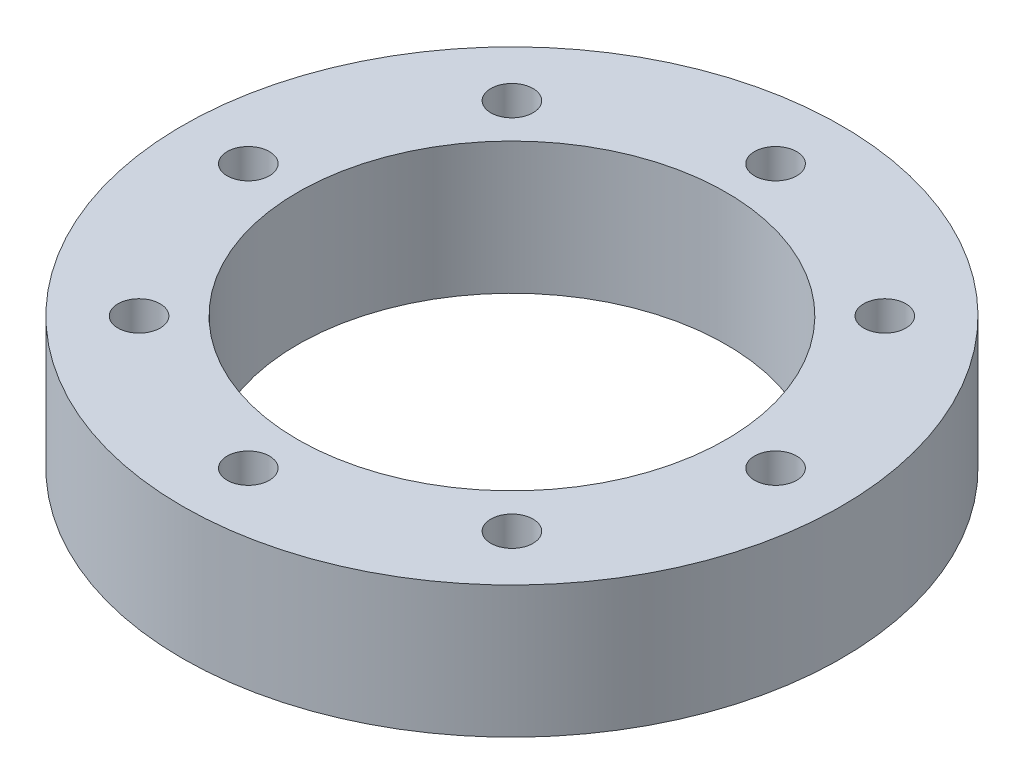
ISO-10303-21;
HEADER;
FILE_DESCRIPTION(('STEP AP214'),'2;1');
FILE_NAME('part.step','',(''),(''),'','','');
FILE_SCHEMA(('AUTOMOTIVE_DESIGN { 1 0 10303 214 1 1 1 1 }'));
ENDSEC;
DATA;
#1=APPLICATION_CONTEXT('core data for automotive mechanical design processes');
#2=APPLICATION_PROTOCOL_DEFINITION('international standard','automotive_design',2000,#1);
#3=PRODUCT_CONTEXT('',#1,'mechanical');
#4=PRODUCT('Part','Part','',(#3));
#5=PRODUCT_RELATED_PRODUCT_CATEGORY('part','',(#4));
#6=PRODUCT_DEFINITION_FORMATION('','',#4);
#7=PRODUCT_DEFINITION_CONTEXT('part definition',#1,'design');
#8=PRODUCT_DEFINITION('design','',#6,#7);
#9=PRODUCT_DEFINITION_SHAPE('','',#8);
#10=(LENGTH_UNIT() NAMED_UNIT(*) SI_UNIT(.MILLI.,.METRE.));
#11=(NAMED_UNIT(*) PLANE_ANGLE_UNIT() SI_UNIT($,.RADIAN.));
#12=(NAMED_UNIT(*) SI_UNIT($,.STERADIAN.) SOLID_ANGLE_UNIT());
#13=UNCERTAINTY_MEASURE_WITH_UNIT(LENGTH_MEASURE(1.E-05),#10,'distance_accuracy_value','');
#14=(GEOMETRIC_REPRESENTATION_CONTEXT(3) GLOBAL_UNCERTAINTY_ASSIGNED_CONTEXT((#13)) GLOBAL_UNIT_ASSIGNED_CONTEXT((#10,
#11,#12)) REPRESENTATION_CONTEXT('',''));
#15=CARTESIAN_POINT('',(0.,0.,0.));
#16=DIRECTION('',(0.,0.,1.));
#17=DIRECTION('',(1.,0.,0.));
#18=AXIS2_PLACEMENT_3D('',#15,#16,#17);
#19=CARTESIAN_POINT('',(0.,20.,0.));
#20=DIRECTION('',(0.,1.,0.));
#21=DIRECTION('',(0.,0.,1.));
#22=AXIS2_PLACEMENT_3D('',#19,#20,#21);
#23=PLANE('',#22);
#24=CARTESIAN_POINT('',(0.,20.,-40.));
#25=DIRECTION('',(0.,1.,0.));
#26=DIRECTION('',(0.,0.,1.));
#27=AXIS2_PLACEMENT_3D('',#24,#25,#26);
#28=CIRCLE('',#27,3.2);
#29=CARTESIAN_POINT('',(0.,20.,-36.8));
#30=VERTEX_POINT('',#29);
#31=EDGE_CURVE('E106',#30,#30,#28,.T.);
#32=ORIENTED_EDGE('',*,*,#31,.F.);
#33=EDGE_LOOP('',(#32));
#34=FACE_BOUND('',#33,.T.);
#35=CARTESIAN_POINT('',(28.2842712474619,20.,-28.2842712474619));
#36=DIRECTION('',(0.,1.,0.));
#37=DIRECTION('',(0.,0.,1.));
#38=AXIS2_PLACEMENT_3D('',#35,#36,#37);
#39=CIRCLE('',#38,3.2);
#40=CARTESIAN_POINT('',(28.2842712474619,20.,-25.0842712474619));
#41=VERTEX_POINT('',#40);
#42=EDGE_CURVE('E100',#41,#41,#39,.T.);
#43=ORIENTED_EDGE('',*,*,#42,.F.);
#44=EDGE_LOOP('',(#43));
#45=FACE_BOUND('',#44,.T.);
#46=CARTESIAN_POINT('',(40.,20.,0.));
#47=DIRECTION('',(0.,1.,0.));
#48=DIRECTION('',(0.,0.,1.));
#49=AXIS2_PLACEMENT_3D('',#46,#47,#48);
#50=CIRCLE('',#49,3.2);
#51=CARTESIAN_POINT('',(40.,20.,3.2));
#52=VERTEX_POINT('',#51);
#53=EDGE_CURVE('E94',#52,#52,#50,.T.);
#54=ORIENTED_EDGE('',*,*,#53,.F.);
#55=EDGE_LOOP('',(#54));
#56=FACE_BOUND('',#55,.T.);
#57=CARTESIAN_POINT('',(28.2842712474619,20.,28.2842712474619));
#58=DIRECTION('',(0.,1.,0.));
#59=DIRECTION('',(0.,0.,1.));
#60=AXIS2_PLACEMENT_3D('',#57,#58,#59);
#61=CIRCLE('',#60,3.2);
#62=CARTESIAN_POINT('',(28.2842712474619,20.,31.4842712474619));
#63=VERTEX_POINT('',#62);
#64=EDGE_CURVE('E88',#63,#63,#61,.T.);
#65=ORIENTED_EDGE('',*,*,#64,.F.);
#66=EDGE_LOOP('',(#65));
#67=FACE_BOUND('',#66,.T.);
#68=CARTESIAN_POINT('',(0.,20.,40.));
#69=DIRECTION('',(0.,1.,0.));
#70=DIRECTION('',(0.,0.,1.));
#71=AXIS2_PLACEMENT_3D('',#68,#69,#70);
#72=CIRCLE('',#71,3.2);
#73=CARTESIAN_POINT('',(0.,20.,43.2));
#74=VERTEX_POINT('',#73);
#75=EDGE_CURVE('E82',#74,#74,#72,.T.);
#76=ORIENTED_EDGE('',*,*,#75,.F.);
#77=EDGE_LOOP('',(#76));
#78=FACE_BOUND('',#77,.T.);
#79=CARTESIAN_POINT('',(-28.2842712474619,20.,28.2842712474619));
#80=DIRECTION('',(0.,1.,0.));
#81=DIRECTION('',(0.,0.,1.));
#82=AXIS2_PLACEMENT_3D('',#79,#80,#81);
#83=CIRCLE('',#82,3.2);
#84=CARTESIAN_POINT('',(-28.2842712474619,20.,31.4842712474619));
#85=VERTEX_POINT('',#84);
#86=EDGE_CURVE('E76',#85,#85,#83,.T.);
#87=ORIENTED_EDGE('',*,*,#86,.F.);
#88=EDGE_LOOP('',(#87));
#89=FACE_BOUND('',#88,.T.);
#90=CARTESIAN_POINT('',(-40.,20.,0.));
#91=DIRECTION('',(0.,1.,0.));
#92=DIRECTION('',(0.,0.,1.));
#93=AXIS2_PLACEMENT_3D('',#90,#91,#92);
#94=CIRCLE('',#93,3.2);
#95=CARTESIAN_POINT('',(-40.,20.,3.20000000000001));
#96=VERTEX_POINT('',#95);
#97=EDGE_CURVE('E70',#96,#96,#94,.T.);
#98=ORIENTED_EDGE('',*,*,#97,.F.);
#99=EDGE_LOOP('',(#98));
#100=FACE_BOUND('',#99,.T.);
#101=CARTESIAN_POINT('',(-28.2842712474619,20.,-28.2842712474619));
#102=DIRECTION('',(0.,1.,0.));
#103=DIRECTION('',(0.,0.,1.));
#104=AXIS2_PLACEMENT_3D('',#101,#102,#103);
#105=CIRCLE('',#104,3.2);
#106=CARTESIAN_POINT('',(-28.2842712474619,20.,-25.0842712474619));
#107=VERTEX_POINT('',#106);
#108=EDGE_CURVE('E64',#107,#107,#105,.T.);
#109=ORIENTED_EDGE('',*,*,#108,.F.);
#110=EDGE_LOOP('',(#109));
#111=FACE_BOUND('',#110,.T.);
#112=CARTESIAN_POINT('',(0.,20.,0.));
#113=DIRECTION('',(0.,1.,0.));
#114=DIRECTION('',(0.,0.,1.));
#115=AXIS2_PLACEMENT_3D('',#112,#113,#114);
#116=CIRCLE('',#115,50.);
#117=CARTESIAN_POINT('',(0.,20.,50.));
#118=VERTEX_POINT('',#117);
#119=EDGE_CURVE('E10',#118,#118,#116,.T.);
#120=ORIENTED_EDGE('',*,*,#119,.T.);
#121=EDGE_LOOP('',(#120));
#122=FACE_BOUND('',#121,.T.);
#123=CARTESIAN_POINT('',(0.,20.,0.));
#124=DIRECTION('',(0.,1.,0.));
#125=DIRECTION('',(0.,0.,1.));
#126=AXIS2_PLACEMENT_3D('',#123,#124,#125);
#127=CIRCLE('',#126,32.5);
#128=CARTESIAN_POINT('',(0.,20.,32.5));
#129=VERTEX_POINT('',#128);
#130=EDGE_CURVE('E56',#129,#129,#127,.T.);
#131=ORIENTED_EDGE('',*,*,#130,.F.);
#132=EDGE_LOOP('',(#131));
#133=FACE_BOUND('',#132,.T.);
#134=ADVANCED_FACE('F45',(#34,#45,#56,#67,#78,#89,#100,#111,#122,#133),#23,.T.);
#135=CARTESIAN_POINT('',(0.,0.,0.));
#136=DIRECTION('',(0.,1.,0.));
#137=DIRECTION('',(0.,0.,1.));
#138=AXIS2_PLACEMENT_3D('',#135,#136,#137);
#139=PLANE('',#138);
#140=CARTESIAN_POINT('',(0.,0.,-40.));
#141=DIRECTION('',(0.,1.,0.));
#142=DIRECTION('',(0.,0.,1.));
#143=AXIS2_PLACEMENT_3D('',#140,#141,#142);
#144=CIRCLE('',#143,3.2);
#145=CARTESIAN_POINT('',(0.,0.,-36.8));
#146=VERTEX_POINT('',#145);
#147=EDGE_CURVE('E61',#146,#146,#144,.T.);
#148=ORIENTED_EDGE('',*,*,#147,.T.);
#149=EDGE_LOOP('',(#148));
#150=FACE_BOUND('',#149,.T.);
#151=CARTESIAN_POINT('',(28.2842712474619,0.,-28.2842712474619));
#152=DIRECTION('',(0.,1.,0.));
#153=DIRECTION('',(0.,0.,1.));
#154=AXIS2_PLACEMENT_3D('',#151,#152,#153);
#155=CIRCLE('',#154,3.2);
#156=CARTESIAN_POINT('',(28.2842712474619,0.,-25.0842712474619));
#157=VERTEX_POINT('',#156);
#158=EDGE_CURVE('E103',#157,#157,#155,.T.);
#159=ORIENTED_EDGE('',*,*,#158,.T.);
#160=EDGE_LOOP('',(#159));
#161=FACE_BOUND('',#160,.T.);
#162=CARTESIAN_POINT('',(40.,0.,0.));
#163=DIRECTION('',(0.,1.,0.));
#164=DIRECTION('',(0.,0.,1.));
#165=AXIS2_PLACEMENT_3D('',#162,#163,#164);
#166=CIRCLE('',#165,3.2);
#167=CARTESIAN_POINT('',(40.,0.,3.2));
#168=VERTEX_POINT('',#167);
#169=EDGE_CURVE('E97',#168,#168,#166,.T.);
#170=ORIENTED_EDGE('',*,*,#169,.T.);
#171=EDGE_LOOP('',(#170));
#172=FACE_BOUND('',#171,.T.);
#173=CARTESIAN_POINT('',(28.2842712474619,0.,28.2842712474619));
#174=DIRECTION('',(0.,1.,0.));
#175=DIRECTION('',(0.,0.,1.));
#176=AXIS2_PLACEMENT_3D('',#173,#174,#175);
#177=CIRCLE('',#176,3.2);
#178=CARTESIAN_POINT('',(28.2842712474619,0.,31.4842712474619));
#179=VERTEX_POINT('',#178);
#180=EDGE_CURVE('E91',#179,#179,#177,.T.);
#181=ORIENTED_EDGE('',*,*,#180,.T.);
#182=EDGE_LOOP('',(#181));
#183=FACE_BOUND('',#182,.T.);
#184=CARTESIAN_POINT('',(0.,0.,40.));
#185=DIRECTION('',(0.,1.,0.));
#186=DIRECTION('',(0.,0.,1.));
#187=AXIS2_PLACEMENT_3D('',#184,#185,#186);
#188=CIRCLE('',#187,3.2);
#189=CARTESIAN_POINT('',(0.,0.,43.2));
#190=VERTEX_POINT('',#189);
#191=EDGE_CURVE('E85',#190,#190,#188,.T.);
#192=ORIENTED_EDGE('',*,*,#191,.T.);
#193=EDGE_LOOP('',(#192));
#194=FACE_BOUND('',#193,.T.);
#195=CARTESIAN_POINT('',(-28.2842712474619,0.,28.2842712474619));
#196=DIRECTION('',(0.,1.,0.));
#197=DIRECTION('',(0.,0.,1.));
#198=AXIS2_PLACEMENT_3D('',#195,#196,#197);
#199=CIRCLE('',#198,3.2);
#200=CARTESIAN_POINT('',(-28.2842712474619,0.,31.4842712474619));
#201=VERTEX_POINT('',#200);
#202=EDGE_CURVE('E79',#201,#201,#199,.T.);
#203=ORIENTED_EDGE('',*,*,#202,.T.);
#204=EDGE_LOOP('',(#203));
#205=FACE_BOUND('',#204,.T.);
#206=CARTESIAN_POINT('',(-40.,0.,0.));
#207=DIRECTION('',(0.,1.,0.));
#208=DIRECTION('',(0.,0.,1.));
#209=AXIS2_PLACEMENT_3D('',#206,#207,#208);
#210=CIRCLE('',#209,3.2);
#211=CARTESIAN_POINT('',(-40.,0.,3.20000000000001));
#212=VERTEX_POINT('',#211);
#213=EDGE_CURVE('E73',#212,#212,#210,.T.);
#214=ORIENTED_EDGE('',*,*,#213,.T.);
#215=EDGE_LOOP('',(#214));
#216=FACE_BOUND('',#215,.T.);
#217=CARTESIAN_POINT('',(-28.2842712474619,0.,-28.2842712474619));
#218=DIRECTION('',(0.,1.,0.));
#219=DIRECTION('',(0.,0.,1.));
#220=AXIS2_PLACEMENT_3D('',#217,#218,#219);
#221=CIRCLE('',#220,3.2);
#222=CARTESIAN_POINT('',(-28.2842712474619,0.,-25.0842712474619));
#223=VERTEX_POINT('',#222);
#224=EDGE_CURVE('E67',#223,#223,#221,.T.);
#225=ORIENTED_EDGE('',*,*,#224,.T.);
#226=EDGE_LOOP('',(#225));
#227=FACE_BOUND('',#226,.T.);
#228=CARTESIAN_POINT('',(0.,0.,0.));
#229=DIRECTION('',(0.,1.,0.));
#230=DIRECTION('',(0.,0.,1.));
#231=AXIS2_PLACEMENT_3D('',#228,#229,#230);
#232=CIRCLE('',#231,50.);
#233=CARTESIAN_POINT('',(0.,0.,50.));
#234=VERTEX_POINT('',#233);
#235=EDGE_CURVE('E49',#234,#234,#232,.T.);
#236=ORIENTED_EDGE('',*,*,#235,.F.);
#237=EDGE_LOOP('',(#236));
#238=FACE_BOUND('',#237,.T.);
#239=CARTESIAN_POINT('',(0.,0.,0.));
#240=DIRECTION('',(0.,1.,0.));
#241=DIRECTION('',(0.,0.,1.));
#242=AXIS2_PLACEMENT_3D('',#239,#240,#241);
#243=CIRCLE('',#242,32.5);
#244=CARTESIAN_POINT('',(0.,0.,32.5));
#245=VERTEX_POINT('',#244);
#246=EDGE_CURVE('E58',#245,#245,#243,.T.);
#247=ORIENTED_EDGE('',*,*,#246,.T.);
#248=EDGE_LOOP('',(#247));
#249=FACE_BOUND('',#248,.T.);
#250=ADVANCED_FACE('F112',(#150,#161,#172,#183,#194,#205,#216,#227,#238,#249),#139,.F.);
#251=CARTESIAN_POINT('',(0.,20.,0.));
#252=DIRECTION('',(0.,-1.,0.));
#253=DIRECTION('',(0.,0.,-1.));
#254=AXIS2_PLACEMENT_3D('',#251,#252,#253);
#255=CYLINDRICAL_SURFACE('',#254,50.);
#256=ORIENTED_EDGE('',*,*,#119,.F.);
#257=EDGE_LOOP('',(#256));
#258=FACE_BOUND('',#257,.T.);
#259=ORIENTED_EDGE('',*,*,#235,.T.);
#260=EDGE_LOOP('',(#259));
#261=FACE_BOUND('',#260,.T.);
#262=ADVANCED_FACE('F47',(#258,#261),#255,.T.);
#263=CARTESIAN_POINT('',(0.,20.,0.));
#264=DIRECTION('',(0.,-1.,0.));
#265=DIRECTION('',(0.,0.,-1.));
#266=AXIS2_PLACEMENT_3D('',#263,#264,#265);
#267=CYLINDRICAL_SURFACE('',#266,32.5);
#268=ORIENTED_EDGE('',*,*,#130,.T.);
#269=EDGE_LOOP('',(#268));
#270=FACE_BOUND('',#269,.T.);
#271=ORIENTED_EDGE('',*,*,#246,.F.);
#272=EDGE_LOOP('',(#271));
#273=FACE_BOUND('',#272,.T.);
#274=ADVANCED_FACE('F141',(#270,#273),#267,.F.);
#275=CARTESIAN_POINT('',(-28.2842712474619,0.,-28.2842712474619));
#276=DIRECTION('',(0.,1.,0.));
#277=DIRECTION('',(0.,0.,1.));
#278=AXIS2_PLACEMENT_3D('',#275,#276,#277);
#279=CYLINDRICAL_SURFACE('',#278,3.2);
#280=ORIENTED_EDGE('',*,*,#224,.F.);
#281=EDGE_LOOP('',(#280));
#282=FACE_BOUND('',#281,.T.);
#283=ORIENTED_EDGE('',*,*,#108,.T.);
#284=EDGE_LOOP('',(#283));
#285=FACE_BOUND('',#284,.T.);
#286=ADVANCED_FACE('F144',(#282,#285),#279,.F.);
#287=CARTESIAN_POINT('',(-40.,0.,0.));
#288=DIRECTION('',(0.,1.,0.));
#289=DIRECTION('',(0.,0.,1.));
#290=AXIS2_PLACEMENT_3D('',#287,#288,#289);
#291=CYLINDRICAL_SURFACE('',#290,3.2);
#292=ORIENTED_EDGE('',*,*,#213,.F.);
#293=EDGE_LOOP('',(#292));
#294=FACE_BOUND('',#293,.T.);
#295=ORIENTED_EDGE('',*,*,#97,.T.);
#296=EDGE_LOOP('',(#295));
#297=FACE_BOUND('',#296,.T.);
#298=ADVANCED_FACE('F157',(#294,#297),#291,.F.);
#299=CARTESIAN_POINT('',(-28.2842712474619,0.,28.2842712474619));
#300=DIRECTION('',(0.,1.,0.));
#301=DIRECTION('',(0.,0.,1.));
#302=AXIS2_PLACEMENT_3D('',#299,#300,#301);
#303=CYLINDRICAL_SURFACE('',#302,3.2);
#304=ORIENTED_EDGE('',*,*,#202,.F.);
#305=EDGE_LOOP('',(#304));
#306=FACE_BOUND('',#305,.T.);
#307=ORIENTED_EDGE('',*,*,#86,.T.);
#308=EDGE_LOOP('',(#307));
#309=FACE_BOUND('',#308,.T.);
#310=ADVANCED_FACE('F161',(#306,#309),#303,.F.);
#311=CARTESIAN_POINT('',(0.,0.,40.));
#312=DIRECTION('',(0.,1.,0.));
#313=DIRECTION('',(0.,0.,1.));
#314=AXIS2_PLACEMENT_3D('',#311,#312,#313);
#315=CYLINDRICAL_SURFACE('',#314,3.2);
#316=ORIENTED_EDGE('',*,*,#191,.F.);
#317=EDGE_LOOP('',(#316));
#318=FACE_BOUND('',#317,.T.);
#319=ORIENTED_EDGE('',*,*,#75,.T.);
#320=EDGE_LOOP('',(#319));
#321=FACE_BOUND('',#320,.T.);
#322=ADVANCED_FACE('F165',(#318,#321),#315,.F.);
#323=CARTESIAN_POINT('',(28.2842712474619,0.,28.2842712474619));
#324=DIRECTION('',(0.,1.,0.));
#325=DIRECTION('',(0.,0.,1.));
#326=AXIS2_PLACEMENT_3D('',#323,#324,#325);
#327=CYLINDRICAL_SURFACE('',#326,3.2);
#328=ORIENTED_EDGE('',*,*,#180,.F.);
#329=EDGE_LOOP('',(#328));
#330=FACE_BOUND('',#329,.T.);
#331=ORIENTED_EDGE('',*,*,#64,.T.);
#332=EDGE_LOOP('',(#331));
#333=FACE_BOUND('',#332,.T.);
#334=ADVANCED_FACE('F169',(#330,#333),#327,.F.);
#335=CARTESIAN_POINT('',(40.,0.,0.));
#336=DIRECTION('',(0.,1.,0.));
#337=DIRECTION('',(0.,0.,1.));
#338=AXIS2_PLACEMENT_3D('',#335,#336,#337);
#339=CYLINDRICAL_SURFACE('',#338,3.2);
#340=ORIENTED_EDGE('',*,*,#169,.F.);
#341=EDGE_LOOP('',(#340));
#342=FACE_BOUND('',#341,.T.);
#343=ORIENTED_EDGE('',*,*,#53,.T.);
#344=EDGE_LOOP('',(#343));
#345=FACE_BOUND('',#344,.T.);
#346=ADVANCED_FACE('F173',(#342,#345),#339,.F.);
#347=CARTESIAN_POINT('',(28.2842712474619,0.,-28.2842712474619));
#348=DIRECTION('',(0.,1.,0.));
#349=DIRECTION('',(0.,0.,1.));
#350=AXIS2_PLACEMENT_3D('',#347,#348,#349);
#351=CYLINDRICAL_SURFACE('',#350,3.2);
#352=ORIENTED_EDGE('',*,*,#158,.F.);
#353=EDGE_LOOP('',(#352));
#354=FACE_BOUND('',#353,.T.);
#355=ORIENTED_EDGE('',*,*,#42,.T.);
#356=EDGE_LOOP('',(#355));
#357=FACE_BOUND('',#356,.T.);
#358=ADVANCED_FACE('F118',(#354,#357),#351,.F.);
#359=CARTESIAN_POINT('',(0.,0.,-40.));
#360=DIRECTION('',(0.,1.,0.));
#361=DIRECTION('',(0.,0.,1.));
#362=AXIS2_PLACEMENT_3D('',#359,#360,#361);
#363=CYLINDRICAL_SURFACE('',#362,3.2);
#364=ORIENTED_EDGE('',*,*,#147,.F.);
#365=EDGE_LOOP('',(#364));
#366=FACE_BOUND('',#365,.T.);
#367=ORIENTED_EDGE('',*,*,#31,.T.);
#368=EDGE_LOOP('',(#367));
#369=FACE_BOUND('',#368,.T.);
#370=ADVANCED_FACE('F115',(#366,#369),#363,.F.);
#371=CLOSED_SHELL('',(#134,#250,#262,#274,#286,#298,#310,#322,#334,#346,#358,#370));
#372=MANIFOLD_SOLID_BREP('B2',#371);
#373=ADVANCED_BREP_SHAPE_REPRESENTATION('',(#18,#372),#14);
#374=SHAPE_DEFINITION_REPRESENTATION(#9,#373);
ENDSEC;
END-ISO-10303-21;
